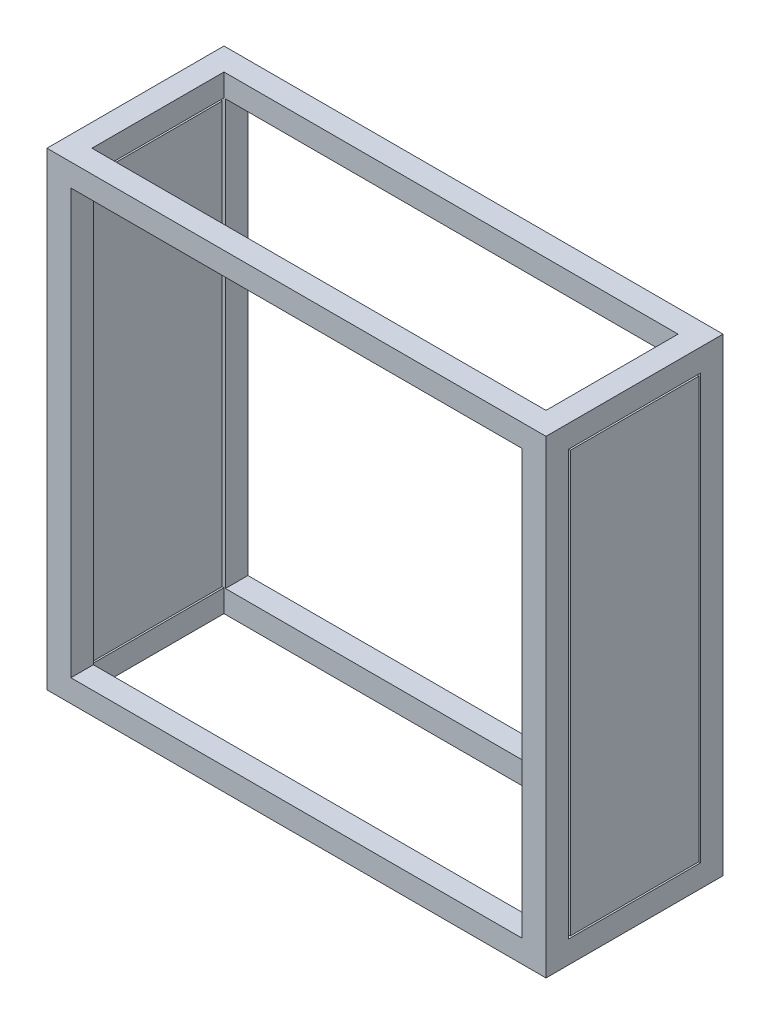
ISO-10303-21;
HEADER;
FILE_DESCRIPTION(('STEP AP214'),'2;1');
FILE_NAME('part.step','',(''),(''),'','','');
FILE_SCHEMA(('AUTOMOTIVE_DESIGN { 1 0 10303 214 1 1 1 1 }'));
ENDSEC;
DATA;
#1=APPLICATION_CONTEXT('core data for automotive mechanical design processes');
#2=APPLICATION_PROTOCOL_DEFINITION('international standard','automotive_design',2000,#1);
#3=PRODUCT_CONTEXT('',#1,'mechanical');
#4=PRODUCT('Part','Part','',(#3));
#5=PRODUCT_RELATED_PRODUCT_CATEGORY('part','',(#4));
#6=PRODUCT_DEFINITION_FORMATION('','',#4);
#7=PRODUCT_DEFINITION_CONTEXT('part definition',#1,'design');
#8=PRODUCT_DEFINITION('design','',#6,#7);
#9=PRODUCT_DEFINITION_SHAPE('','',#8);
#10=(LENGTH_UNIT() NAMED_UNIT(*) SI_UNIT(.MILLI.,.METRE.));
#11=(NAMED_UNIT(*) PLANE_ANGLE_UNIT() SI_UNIT($,.RADIAN.));
#12=(NAMED_UNIT(*) SI_UNIT($,.STERADIAN.) SOLID_ANGLE_UNIT());
#13=UNCERTAINTY_MEASURE_WITH_UNIT(LENGTH_MEASURE(1.E-05),#10,'distance_accuracy_value','');
#14=(GEOMETRIC_REPRESENTATION_CONTEXT(3) GLOBAL_UNCERTAINTY_ASSIGNED_CONTEXT((#13)) GLOBAL_UNIT_ASSIGNED_CONTEXT((#10,
#11,#12)) REPRESENTATION_CONTEXT('',''));
#15=CARTESIAN_POINT('',(0.,0.,0.));
#16=DIRECTION('',(0.,0.,1.));
#17=DIRECTION('',(1.,0.,0.));
#18=AXIS2_PLACEMENT_3D('',#15,#16,#17);
#19=CARTESIAN_POINT('',(-256.5,-237.6,-172.6));
#20=DIRECTION('',(0.,0.,-1.));
#21=DIRECTION('',(0.,1.,0.));
#22=AXIS2_PLACEMENT_3D('',#19,#20,#21);
#23=PLANE('',#22);
#24=DIRECTION('',(-1.,0.,0.));
#25=VECTOR('',#24,1.);
#26=CARTESIAN_POINT('',(-256.5,-237.6,-172.6));
#27=LINE('',#26,#25);
#28=CARTESIAN_POINT('',(-256.5,-237.6,-172.6));
#29=VERTEX_POINT('',#28);
#30=CARTESIAN_POINT('',(-271.9,-237.6,-172.6));
#31=VERTEX_POINT('',#30);
#32=EDGE_CURVE('E46',#29,#31,#27,.T.);
#33=ORIENTED_EDGE('',*,*,#32,.T.);
#34=DIRECTION('',(0.,-1.,0.));
#35=VECTOR('',#34,1.);
#36=CARTESIAN_POINT('',(-271.9,-237.6,-172.6));
#37=LINE('',#36,#35);
#38=CARTESIAN_POINT('',(-271.9,237.6,-172.6));
#39=VERTEX_POINT('',#38);
#40=EDGE_CURVE('E59',#39,#31,#37,.T.);
#41=ORIENTED_EDGE('',*,*,#40,.F.);
#42=DIRECTION('',(-1.,0.,0.));
#43=VECTOR('',#42,1.);
#44=CARTESIAN_POINT('',(-256.5,237.6,-172.6));
#45=LINE('',#44,#43);
#46=CARTESIAN_POINT('',(-256.5,237.6,-172.6));
#47=VERTEX_POINT('',#46);
#48=EDGE_CURVE('E12',#47,#39,#45,.T.);
#49=ORIENTED_EDGE('',*,*,#48,.F.);
#50=DIRECTION('',(0.,-1.,0.));
#51=VECTOR('',#50,1.);
#52=CARTESIAN_POINT('',(-256.5,-237.6,-172.6));
#53=LINE('',#52,#51);
#54=EDGE_CURVE('E110',#47,#29,#53,.T.);
#55=ORIENTED_EDGE('',*,*,#54,.T.);
#56=EDGE_LOOP('',(#33,#41,#49,#55));
#57=FACE_BOUND('',#56,.T.);
#58=ADVANCED_FACE('F43',(#57),#23,.T.);
#59=CARTESIAN_POINT('',(-256.5,237.6,-172.6));
#60=DIRECTION('',(0.,1.,0.));
#61=DIRECTION('',(0.,0.,1.));
#62=AXIS2_PLACEMENT_3D('',#59,#60,#61);
#63=PLANE('',#62);
#64=ORIENTED_EDGE('',*,*,#48,.T.);
#65=DIRECTION('',(0.,0.,-1.));
#66=VECTOR('',#65,1.);
#67=CARTESIAN_POINT('',(-271.9,237.6,-27.4));
#68=LINE('',#67,#66);
#69=CARTESIAN_POINT('',(-271.9,237.6,-27.4));
#70=VERTEX_POINT('',#69);
#71=EDGE_CURVE('E96',#70,#39,#68,.T.);
#72=ORIENTED_EDGE('',*,*,#71,.F.);
#73=DIRECTION('',(-1.,0.,0.));
#74=VECTOR('',#73,1.);
#75=CARTESIAN_POINT('',(-256.5,237.6,-27.4));
#76=LINE('',#75,#74);
#77=CARTESIAN_POINT('',(-256.5,237.6,-27.4));
#78=VERTEX_POINT('',#77);
#79=EDGE_CURVE('E51',#78,#70,#76,.T.);
#80=ORIENTED_EDGE('',*,*,#79,.F.);
#81=DIRECTION('',(0.,0.,-1.));
#82=VECTOR('',#81,1.);
#83=CARTESIAN_POINT('',(-256.5,237.6,-172.6));
#84=LINE('',#83,#82);
#85=EDGE_CURVE('E103',#78,#47,#84,.T.);
#86=ORIENTED_EDGE('',*,*,#85,.T.);
#87=EDGE_LOOP('',(#64,#72,#80,#86));
#88=FACE_BOUND('',#87,.T.);
#89=ADVANCED_FACE('F114',(#88),#63,.T.);
#90=CARTESIAN_POINT('',(-256.5,237.6,-27.4));
#91=DIRECTION('',(0.,0.,1.));
#92=DIRECTION('',(0.,-1.,0.));
#93=AXIS2_PLACEMENT_3D('',#90,#91,#92);
#94=PLANE('',#93);
#95=ORIENTED_EDGE('',*,*,#79,.T.);
#96=DIRECTION('',(0.,1.,0.));
#97=VECTOR('',#96,1.);
#98=CARTESIAN_POINT('',(-271.9,-237.6,-27.4));
#99=LINE('',#98,#97);
#100=CARTESIAN_POINT('',(-271.9,-237.6,-27.4));
#101=VERTEX_POINT('',#100);
#102=EDGE_CURVE('E84',#101,#70,#99,.T.);
#103=ORIENTED_EDGE('',*,*,#102,.F.);
#104=DIRECTION('',(-1.,0.,0.));
#105=VECTOR('',#104,1.);
#106=CARTESIAN_POINT('',(-256.5,-237.6,-27.4000000000001));
#107=LINE('',#106,#105);
#108=CARTESIAN_POINT('',(-256.5,-237.6,-27.4000000000001));
#109=VERTEX_POINT('',#108);
#110=EDGE_CURVE('E94',#109,#101,#107,.T.);
#111=ORIENTED_EDGE('',*,*,#110,.F.);
#112=DIRECTION('',(0.,1.,0.));
#113=VECTOR('',#112,1.);
#114=CARTESIAN_POINT('',(-256.5,237.6,-27.4));
#115=LINE('',#114,#113);
#116=EDGE_CURVE('E107',#109,#78,#115,.T.);
#117=ORIENTED_EDGE('',*,*,#116,.T.);
#118=EDGE_LOOP('',(#95,#103,#111,#117));
#119=FACE_BOUND('',#118,.T.);
#120=ADVANCED_FACE('F92',(#119),#94,.T.);
#121=CARTESIAN_POINT('',(-256.5,-237.6,-27.4000000000001));
#122=DIRECTION('',(0.,-1.,0.));
#123=DIRECTION('',(0.,0.,-1.));
#124=AXIS2_PLACEMENT_3D('',#121,#122,#123);
#125=PLANE('',#124);
#126=ORIENTED_EDGE('',*,*,#110,.T.);
#127=DIRECTION('',(0.,0.,1.));
#128=VECTOR('',#127,1.);
#129=CARTESIAN_POINT('',(-271.9,-237.6,-27.4));
#130=LINE('',#129,#128);
#131=EDGE_CURVE('E81',#31,#101,#130,.T.);
#132=ORIENTED_EDGE('',*,*,#131,.F.);
#133=ORIENTED_EDGE('',*,*,#32,.F.);
#134=DIRECTION('',(0.,0.,1.));
#135=VECTOR('',#134,1.);
#136=CARTESIAN_POINT('',(-256.5,-237.6,-27.4000000000001));
#137=LINE('',#136,#135);
#138=EDGE_CURVE('E101',#29,#109,#137,.T.);
#139=ORIENTED_EDGE('',*,*,#138,.T.);
#140=EDGE_LOOP('',(#126,#132,#133,#139));
#141=FACE_BOUND('',#140,.T.);
#142=ADVANCED_FACE('F99',(#141),#125,.T.);
#143=CARTESIAN_POINT('',(-256.5,0.,0.));
#144=DIRECTION('',(1.,0.,0.));
#145=DIRECTION('',(0.,0.,-1.));
#146=AXIS2_PLACEMENT_3D('',#143,#144,#145);
#147=PLANE('',#146);
#148=ORIENTED_EDGE('',*,*,#54,.F.);
#149=ORIENTED_EDGE('',*,*,#85,.F.);
#150=ORIENTED_EDGE('',*,*,#116,.F.);
#151=ORIENTED_EDGE('',*,*,#138,.F.);
#152=EDGE_LOOP('',(#148,#149,#150,#151));
#153=FACE_BOUND('',#152,.T.);
#154=ADVANCED_FACE('F117',(#153),#147,.T.);
#155=CARTESIAN_POINT('',(-271.9,0.,0.));
#156=DIRECTION('',(-1.,0.,0.));
#157=DIRECTION('',(0.,0.,1.));
#158=AXIS2_PLACEMENT_3D('',#155,#156,#157);
#159=PLANE('',#158);
#160=ORIENTED_EDGE('',*,*,#40,.T.);
#161=ORIENTED_EDGE('',*,*,#131,.T.);
#162=ORIENTED_EDGE('',*,*,#102,.T.);
#163=ORIENTED_EDGE('',*,*,#71,.T.);
#164=EDGE_LOOP('',(#160,#161,#162,#163));
#165=FACE_BOUND('',#164,.T.);
#166=ADVANCED_FACE('F83',(#165),#159,.T.);
#167=CLOSED_SHELL('',(#58,#89,#120,#142,#154,#166));
#168=MANIFOLD_SOLID_BREP('B2',#167);
#169=CARTESIAN_POINT('',(256.5,237.6,-172.6));
#170=DIRECTION('',(0.,0.,-1.));
#171=DIRECTION('',(0.,1.,0.));
#172=AXIS2_PLACEMENT_3D('',#169,#170,#171);
#173=PLANE('',#172);
#174=DIRECTION('',(0.,1.,0.));
#175=VECTOR('',#174,1.);
#176=CARTESIAN_POINT('',(281.9,237.6,-172.6));
#177=LINE('',#176,#175);
#178=CARTESIAN_POINT('',(281.9,-237.6,-172.6));
#179=VERTEX_POINT('',#178);
#180=CARTESIAN_POINT('',(281.9,237.6,-172.6));
#181=VERTEX_POINT('',#180);
#182=EDGE_CURVE('E239',#179,#181,#177,.T.);
#183=ORIENTED_EDGE('',*,*,#182,.F.);
#184=DIRECTION('',(1.,0.,0.));
#185=VECTOR('',#184,1.);
#186=CARTESIAN_POINT('',(256.5,-237.6,-172.6));
#187=LINE('',#186,#185);
#188=CARTESIAN_POINT('',(256.5,-237.6,-172.6));
#189=VERTEX_POINT('',#188);
#190=EDGE_CURVE('E41',#189,#179,#187,.T.);
#191=ORIENTED_EDGE('',*,*,#190,.F.);
#192=DIRECTION('',(0.,1.,0.));
#193=VECTOR('',#192,1.);
#194=CARTESIAN_POINT('',(256.5,237.6,-172.6));
#195=LINE('',#194,#193);
#196=CARTESIAN_POINT('',(256.5,237.6,-172.6));
#197=VERTEX_POINT('',#196);
#198=EDGE_CURVE('E233',#189,#197,#195,.T.);
#199=ORIENTED_EDGE('',*,*,#198,.T.);
#200=DIRECTION('',(1.,0.,0.));
#201=VECTOR('',#200,1.);
#202=CARTESIAN_POINT('',(256.5,237.6,-172.6));
#203=LINE('',#202,#201);
#204=EDGE_CURVE('E178',#197,#181,#203,.T.);
#205=ORIENTED_EDGE('',*,*,#204,.T.);
#206=EDGE_LOOP('',(#183,#191,#199,#205));
#207=FACE_BOUND('',#206,.T.);
#208=ADVANCED_FACE('F175',(#207),#173,.T.);
#209=CARTESIAN_POINT('',(256.5,-237.6,-27.4000000000001));
#210=DIRECTION('',(0.,-1.,0.));
#211=DIRECTION('',(1.,0.,0.));
#212=AXIS2_PLACEMENT_3D('',#209,#210,#211);
#213=PLANE('',#212);
#214=DIRECTION('',(0.,0.,-1.));
#215=VECTOR('',#214,1.);
#216=CARTESIAN_POINT('',(281.9,-237.6,-27.4000000000001));
#217=LINE('',#216,#215);
#218=CARTESIAN_POINT('',(281.9,-237.6,-27.4000000000001));
#219=VERTEX_POINT('',#218);
#220=EDGE_CURVE('E235',#219,#179,#217,.T.);
#221=ORIENTED_EDGE('',*,*,#220,.F.);
#222=DIRECTION('',(1.,0.,0.));
#223=VECTOR('',#222,1.);
#224=CARTESIAN_POINT('',(256.5,-237.6,-27.4000000000001));
#225=LINE('',#224,#223);
#226=CARTESIAN_POINT('',(256.5,-237.6,-27.4000000000001));
#227=VERTEX_POINT('',#226);
#228=EDGE_CURVE('E184',#227,#219,#225,.T.);
#229=ORIENTED_EDGE('',*,*,#228,.F.);
#230=DIRECTION('',(0.,0.,-1.));
#231=VECTOR('',#230,1.);
#232=CARTESIAN_POINT('',(256.5,-237.6,-27.4000000000001));
#233=LINE('',#232,#231);
#234=EDGE_CURVE('E230',#227,#189,#233,.T.);
#235=ORIENTED_EDGE('',*,*,#234,.T.);
#236=ORIENTED_EDGE('',*,*,#190,.T.);
#237=EDGE_LOOP('',(#221,#229,#235,#236));
#238=FACE_BOUND('',#237,.T.);
#239=ADVANCED_FACE('F249',(#238),#213,.T.);
#240=CARTESIAN_POINT('',(256.5,237.6,-27.4));
#241=DIRECTION('',(0.,0.,1.));
#242=DIRECTION('',(0.,-1.,0.));
#243=AXIS2_PLACEMENT_3D('',#240,#241,#242);
#244=PLANE('',#243);
#245=DIRECTION('',(0.,-1.,0.));
#246=VECTOR('',#245,1.);
#247=CARTESIAN_POINT('',(281.9,237.6,-27.4));
#248=LINE('',#247,#246);
#249=CARTESIAN_POINT('',(281.9,237.6,-27.4));
#250=VERTEX_POINT('',#249);
#251=EDGE_CURVE('E225',#250,#219,#248,.T.);
#252=ORIENTED_EDGE('',*,*,#251,.F.);
#253=DIRECTION('',(1.,0.,0.));
#254=VECTOR('',#253,1.);
#255=CARTESIAN_POINT('',(256.5,237.6,-27.4));
#256=LINE('',#255,#254);
#257=CARTESIAN_POINT('',(256.5,237.6,-27.4));
#258=VERTEX_POINT('',#257);
#259=EDGE_CURVE('E220',#258,#250,#256,.T.);
#260=ORIENTED_EDGE('',*,*,#259,.F.);
#261=DIRECTION('',(0.,-1.,0.));
#262=VECTOR('',#261,1.);
#263=CARTESIAN_POINT('',(256.5,237.6,-27.4));
#264=LINE('',#263,#262);
#265=EDGE_CURVE('E223',#258,#227,#264,.T.);
#266=ORIENTED_EDGE('',*,*,#265,.T.);
#267=ORIENTED_EDGE('',*,*,#228,.T.);
#268=EDGE_LOOP('',(#252,#260,#266,#267));
#269=FACE_BOUND('',#268,.T.);
#270=ADVANCED_FACE('F222',(#269),#244,.T.);
#271=CARTESIAN_POINT('',(256.5,237.6,-27.4));
#272=DIRECTION('',(0.,1.,0.));
#273=DIRECTION('',(-1.,0.,0.));
#274=AXIS2_PLACEMENT_3D('',#271,#272,#273);
#275=PLANE('',#274);
#276=DIRECTION('',(0.,0.,1.));
#277=VECTOR('',#276,1.);
#278=CARTESIAN_POINT('',(281.9,237.6,-27.4));
#279=LINE('',#278,#277);
#280=EDGE_CURVE('E242',#181,#250,#279,.T.);
#281=ORIENTED_EDGE('',*,*,#280,.F.);
#282=ORIENTED_EDGE('',*,*,#204,.F.);
#283=DIRECTION('',(0.,0.,1.));
#284=VECTOR('',#283,1.);
#285=CARTESIAN_POINT('',(256.5,237.6,-27.4));
#286=LINE('',#285,#284);
#287=EDGE_CURVE('E229',#197,#258,#286,.T.);
#288=ORIENTED_EDGE('',*,*,#287,.T.);
#289=ORIENTED_EDGE('',*,*,#259,.T.);
#290=EDGE_LOOP('',(#281,#282,#288,#289));
#291=FACE_BOUND('',#290,.T.);
#292=ADVANCED_FACE('F232',(#291),#275,.T.);
#293=CARTESIAN_POINT('',(256.5,0.,0.));
#294=DIRECTION('',(1.,0.,0.));
#295=DIRECTION('',(0.,1.,0.));
#296=AXIS2_PLACEMENT_3D('',#293,#294,#295);
#297=PLANE('',#296);
#298=ORIENTED_EDGE('',*,*,#198,.F.);
#299=ORIENTED_EDGE('',*,*,#234,.F.);
#300=ORIENTED_EDGE('',*,*,#265,.F.);
#301=ORIENTED_EDGE('',*,*,#287,.F.);
#302=EDGE_LOOP('',(#298,#299,#300,#301));
#303=FACE_BOUND('',#302,.T.);
#304=ADVANCED_FACE('F228',(#303),#297,.F.);
#305=CARTESIAN_POINT('',(281.9,0.,0.));
#306=DIRECTION('',(1.,0.,0.));
#307=DIRECTION('',(0.,1.,0.));
#308=AXIS2_PLACEMENT_3D('',#305,#306,#307);
#309=PLANE('',#308);
#310=ORIENTED_EDGE('',*,*,#182,.T.);
#311=ORIENTED_EDGE('',*,*,#280,.T.);
#312=ORIENTED_EDGE('',*,*,#251,.T.);
#313=ORIENTED_EDGE('',*,*,#220,.T.);
#314=EDGE_LOOP('',(#310,#311,#312,#313));
#315=FACE_BOUND('',#314,.T.);
#316=ADVANCED_FACE('F248',(#315),#309,.T.);
#317=CLOSED_SHELL('',(#208,#239,#270,#292,#304,#316));
#318=MANIFOLD_SOLID_BREP('B6',#317);
#319=CARTESIAN_POINT('',(-254.880150943396,-239.6,-200.));
#320=DIRECTION('',(0.,-1.,0.));
#321=DIRECTION('',(0.,0.,-1.));
#322=AXIS2_PLACEMENT_3D('',#319,#320,#321);
#323=PLANE('',#322);
#324=DIRECTION('',(1.,0.,0.));
#325=VECTOR('',#324,1.);
#326=CARTESIAN_POINT('',(-783.789708999896,-239.6,-25.4));
#327=LINE('',#326,#325);
#328=CARTESIAN_POINT('',(-281.9,-239.6,-25.4));
#329=VERTEX_POINT('',#328);
#330=CARTESIAN_POINT('',(-256.5,-239.6,-25.4));
#331=VERTEX_POINT('',#330);
#332=EDGE_CURVE('E542',#329,#331,#327,.T.);
#333=ORIENTED_EDGE('',*,*,#332,.T.);
#334=DIRECTION('',(0.,0.,-1.));
#335=VECTOR('',#334,1.);
#336=CARTESIAN_POINT('',(-256.5,-239.6,-200.));
#337=LINE('',#336,#335);
#338=CARTESIAN_POINT('',(-256.5,-239.6,-174.6));
#339=VERTEX_POINT('',#338);
#340=EDGE_CURVE('E486',#331,#339,#337,.T.);
#341=ORIENTED_EDGE('',*,*,#340,.T.);
#342=DIRECTION('',(1.,0.,0.));
#343=VECTOR('',#342,1.);
#344=CARTESIAN_POINT('',(-783.789708999896,-239.6,-174.6));
#345=LINE('',#344,#343);
#346=CARTESIAN_POINT('',(-281.9,-239.6,-174.6));
#347=VERTEX_POINT('',#346);
#348=EDGE_CURVE('E537',#347,#339,#345,.T.);
#349=ORIENTED_EDGE('',*,*,#348,.F.);
#350=DIRECTION('',(0.,0.,-1.));
#351=VECTOR('',#350,1.);
#352=CARTESIAN_POINT('',(-281.9,-239.6,-25.4));
#353=LINE('',#352,#351);
#354=EDGE_CURVE('E538',#329,#347,#353,.T.);
#355=ORIENTED_EDGE('',*,*,#354,.F.);
#356=EDGE_LOOP('',(#333,#341,#349,#355));
#357=FACE_BOUND('',#356,.T.);
#358=ADVANCED_FACE('F298',(#357),#323,.F.);
#359=DIRECTION('',(0.,0.,1.));
#360=VECTOR('',#359,1.);
#361=CARTESIAN_POINT('',(254.880150943396,-239.6,-200.));
#362=LINE('',#361,#360);
#363=CARTESIAN_POINT('',(254.880150943396,-239.6,-25.4));
#364=VERTEX_POINT('',#363);
#365=CARTESIAN_POINT('',(254.880150943396,-239.6,0.));
#366=VERTEX_POINT('',#365);
#367=EDGE_CURVE('E593',#364,#366,#362,.T.);
#368=ORIENTED_EDGE('',*,*,#367,.F.);
#369=DIRECTION('',(-1.,0.,0.));
#370=VECTOR('',#369,1.);
#371=CARTESIAN_POINT('',(-254.880150943396,-239.6,-25.4));
#372=LINE('',#371,#370);
#373=CARTESIAN_POINT('',(-254.880150943396,-239.6,-25.4));
#374=VERTEX_POINT('',#373);
#375=EDGE_CURVE('E173',#364,#374,#372,.T.);
#376=ORIENTED_EDGE('',*,*,#375,.T.);
#377=DIRECTION('',(0.,0.,1.));
#378=VECTOR('',#377,1.);
#379=CARTESIAN_POINT('',(-254.880150943396,-239.6,-200.));
#380=LINE('',#379,#378);
#381=CARTESIAN_POINT('',(-254.880150943396,-239.6,0.));
#382=VERTEX_POINT('',#381);
#383=EDGE_CURVE('E597',#374,#382,#380,.T.);
#384=ORIENTED_EDGE('',*,*,#383,.T.);
#385=DIRECTION('',(1.,0.,0.));
#386=VECTOR('',#385,1.);
#387=CARTESIAN_POINT('',(-254.880150943396,-239.6,0.));
#388=LINE('',#387,#386);
#389=EDGE_CURVE('E569',#382,#366,#388,.T.);
#390=ORIENTED_EDGE('',*,*,#389,.T.);
#391=EDGE_LOOP('',(#368,#376,#384,#390));
#392=FACE_BOUND('',#391,.T.);
#393=ADVANCED_FACE('F672',(#392),#323,.F.);
#394=CARTESIAN_POINT('',(256.5,-239.6,-174.6));
#395=VERTEX_POINT('',#394);
#396=CARTESIAN_POINT('',(281.9,-239.6,-174.6));
#397=VERTEX_POINT('',#396);
#398=EDGE_CURVE('E541',#395,#397,#345,.T.);
#399=ORIENTED_EDGE('',*,*,#398,.F.);
#400=DIRECTION('',(0.,0.,1.));
#401=VECTOR('',#400,1.);
#402=CARTESIAN_POINT('',(256.5,-239.6,-200.));
#403=LINE('',#402,#401);
#404=CARTESIAN_POINT('',(256.5,-239.6,-25.4));
#405=VERTEX_POINT('',#404);
#406=EDGE_CURVE('E462',#395,#405,#403,.T.);
#407=ORIENTED_EDGE('',*,*,#406,.T.);
#408=CARTESIAN_POINT('',(281.9,-239.6,-25.4));
#409=VERTEX_POINT('',#408);
#410=EDGE_CURVE('E546',#405,#409,#327,.T.);
#411=ORIENTED_EDGE('',*,*,#410,.T.);
#412=DIRECTION('',(0.,0.,-1.));
#413=VECTOR('',#412,1.);
#414=CARTESIAN_POINT('',(281.9,-239.6,-25.4));
#415=LINE('',#414,#413);
#416=EDGE_CURVE('E518',#409,#397,#415,.T.);
#417=ORIENTED_EDGE('',*,*,#416,.T.);
#418=EDGE_LOOP('',(#399,#407,#411,#417));
#419=FACE_BOUND('',#418,.T.);
#420=ADVANCED_FACE('F659',(#419),#323,.F.);
#421=CARTESIAN_POINT('',(-254.880150943396,239.6,-200.));
#422=DIRECTION('',(0.,1.,0.));
#423=DIRECTION('',(0.,0.,1.));
#424=AXIS2_PLACEMENT_3D('',#421,#422,#423);
#425=PLANE('',#424);
#426=DIRECTION('',(1.,0.,0.));
#427=VECTOR('',#426,1.);
#428=CARTESIAN_POINT('',(-783.789708999896,239.6,-174.6));
#429=LINE('',#428,#427);
#430=CARTESIAN_POINT('',(-281.9,239.6,-174.6));
#431=VERTEX_POINT('',#430);
#432=CARTESIAN_POINT('',(-256.5,239.6,-174.6));
#433=VERTEX_POINT('',#432);
#434=EDGE_CURVE('E553',#431,#433,#429,.T.);
#435=ORIENTED_EDGE('',*,*,#434,.T.);
#436=DIRECTION('',(0.,0.,1.));
#437=VECTOR('',#436,1.);
#438=CARTESIAN_POINT('',(-256.5,239.6,-200.));
#439=LINE('',#438,#437);
#440=CARTESIAN_POINT('',(-256.5,239.6,-25.4));
#441=VERTEX_POINT('',#440);
#442=EDGE_CURVE('E514',#433,#441,#439,.T.);
#443=ORIENTED_EDGE('',*,*,#442,.T.);
#444=DIRECTION('',(1.,0.,0.));
#445=VECTOR('',#444,1.);
#446=CARTESIAN_POINT('',(-783.789708999896,239.6,-25.4));
#447=LINE('',#446,#445);
#448=CARTESIAN_POINT('',(-281.9,239.6,-25.4));
#449=VERTEX_POINT('',#448);
#450=EDGE_CURVE('E547',#449,#441,#447,.T.);
#451=ORIENTED_EDGE('',*,*,#450,.F.);
#452=DIRECTION('',(0.,0.,1.));
#453=VECTOR('',#452,1.);
#454=CARTESIAN_POINT('',(-281.9,239.6,-25.4));
#455=LINE('',#454,#453);
#456=EDGE_CURVE('E521',#431,#449,#455,.T.);
#457=ORIENTED_EDGE('',*,*,#456,.F.);
#458=EDGE_LOOP('',(#435,#443,#451,#457));
#459=FACE_BOUND('',#458,.T.);
#460=ADVANCED_FACE('F675',(#459),#425,.F.);
#461=DIRECTION('',(0.,0.,1.));
#462=VECTOR('',#461,1.);
#463=CARTESIAN_POINT('',(254.880150943396,239.6,-200.));
#464=LINE('',#463,#462);
#465=CARTESIAN_POINT('',(254.880150943396,239.6,-200.));
#466=VERTEX_POINT('',#465);
#467=CARTESIAN_POINT('',(254.880150943396,239.6,-174.6));
#468=VERTEX_POINT('',#467);
#469=EDGE_CURVE('E602',#466,#468,#464,.T.);
#470=ORIENTED_EDGE('',*,*,#469,.T.);
#471=DIRECTION('',(-1.,0.,0.));
#472=VECTOR('',#471,1.);
#473=CARTESIAN_POINT('',(-254.880150943396,239.6,-174.6));
#474=LINE('',#473,#472);
#475=CARTESIAN_POINT('',(-254.880150943396,239.6,-174.6));
#476=VERTEX_POINT('',#475);
#477=EDGE_CURVE('E306',#468,#476,#474,.T.);
#478=ORIENTED_EDGE('',*,*,#477,.T.);
#479=DIRECTION('',(0.,0.,1.));
#480=VECTOR('',#479,1.);
#481=CARTESIAN_POINT('',(-254.880150943396,239.6,-200.));
#482=LINE('',#481,#480);
#483=CARTESIAN_POINT('',(-254.880150943396,239.6,-200.));
#484=VERTEX_POINT('',#483);
#485=EDGE_CURVE('E598',#484,#476,#482,.T.);
#486=ORIENTED_EDGE('',*,*,#485,.F.);
#487=DIRECTION('',(-1.,0.,0.));
#488=VECTOR('',#487,1.);
#489=CARTESIAN_POINT('',(-254.880150943396,239.6,-200.));
#490=LINE('',#489,#488);
#491=EDGE_CURVE('E568',#466,#484,#490,.T.);
#492=ORIENTED_EDGE('',*,*,#491,.F.);
#493=EDGE_LOOP('',(#470,#478,#486,#492));
#494=FACE_BOUND('',#493,.T.);
#495=ADVANCED_FACE('F641',(#494),#425,.F.);
#496=CARTESIAN_POINT('',(256.5,239.6,-25.4));
#497=VERTEX_POINT('',#496);
#498=CARTESIAN_POINT('',(281.9,239.6,-25.4));
#499=VERTEX_POINT('',#498);
#500=EDGE_CURVE('E532',#497,#499,#447,.T.);
#501=ORIENTED_EDGE('',*,*,#500,.F.);
#502=DIRECTION('',(0.,0.,-1.));
#503=VECTOR('',#502,1.);
#504=CARTESIAN_POINT('',(256.5,239.6,-200.));
#505=LINE('',#504,#503);
#506=CARTESIAN_POINT('',(256.5,239.6,-174.6));
#507=VERTEX_POINT('',#506);
#508=EDGE_CURVE('E505',#497,#507,#505,.T.);
#509=ORIENTED_EDGE('',*,*,#508,.T.);
#510=CARTESIAN_POINT('',(281.9,239.6,-174.6));
#511=VERTEX_POINT('',#510);
#512=EDGE_CURVE('E536',#507,#511,#429,.T.);
#513=ORIENTED_EDGE('',*,*,#512,.T.);
#514=DIRECTION('',(0.,0.,1.));
#515=VECTOR('',#514,1.);
#516=CARTESIAN_POINT('',(281.9,239.6,-25.4));
#517=LINE('',#516,#515);
#518=EDGE_CURVE('E525',#511,#499,#517,.T.);
#519=ORIENTED_EDGE('',*,*,#518,.T.);
#520=EDGE_LOOP('',(#501,#509,#513,#519));
#521=FACE_BOUND('',#520,.T.);
#522=ADVANCED_FACE('F694',(#521),#425,.F.);
#523=CARTESIAN_POINT('',(254.880150943396,239.6,-200.));
#524=DIRECTION('',(1.,0.,0.));
#525=DIRECTION('',(0.,0.,-1.));
#526=AXIS2_PLACEMENT_3D('',#523,#524,#525);
#527=PLANE('',#526);
#528=CARTESIAN_POINT('',(254.880150943396,239.6,-25.4));
#529=VERTEX_POINT('',#528);
#530=CARTESIAN_POINT('',(254.880150943396,239.6,0.));
#531=VERTEX_POINT('',#530);
#532=EDGE_CURVE('E578',#529,#531,#464,.T.);
#533=ORIENTED_EDGE('',*,*,#532,.F.);
#534=DIRECTION('',(0.,-1.,0.));
#535=VECTOR('',#534,1.);
#536=CARTESIAN_POINT('',(254.880150943396,239.6,-25.4));
#537=LINE('',#536,#535);
#538=EDGE_CURVE('E562',#529,#364,#537,.T.);
#539=ORIENTED_EDGE('',*,*,#538,.T.);
#540=ORIENTED_EDGE('',*,*,#367,.T.);
#541=DIRECTION('',(0.,1.,0.));
#542=VECTOR('',#541,1.);
#543=CARTESIAN_POINT('',(254.880150943396,239.6,0.));
#544=LINE('',#543,#542);
#545=EDGE_CURVE('E564',#366,#531,#544,.T.);
#546=ORIENTED_EDGE('',*,*,#545,.T.);
#547=EDGE_LOOP('',(#533,#539,#540,#546));
#548=FACE_BOUND('',#547,.T.);
#549=ADVANCED_FACE('F669',(#548),#527,.F.);
#550=CARTESIAN_POINT('',(-254.880150943396,239.6,-200.));
#551=DIRECTION('',(-1.,0.,0.));
#552=DIRECTION('',(0.,0.,1.));
#553=AXIS2_PLACEMENT_3D('',#550,#551,#552);
#554=PLANE('',#553);
#555=ORIENTED_EDGE('',*,*,#383,.F.);
#556=DIRECTION('',(0.,1.,0.));
#557=VECTOR('',#556,1.);
#558=CARTESIAN_POINT('',(-254.880150943396,239.6,-25.4));
#559=LINE('',#558,#557);
#560=CARTESIAN_POINT('',(-254.880150943396,239.6,-25.4));
#561=VERTEX_POINT('',#560);
#562=EDGE_CURVE('E560',#374,#561,#559,.T.);
#563=ORIENTED_EDGE('',*,*,#562,.T.);
#564=CARTESIAN_POINT('',(-254.880150943396,239.6,0.));
#565=VERTEX_POINT('',#564);
#566=EDGE_CURVE('E601',#561,#565,#482,.T.);
#567=ORIENTED_EDGE('',*,*,#566,.T.);
#568=DIRECTION('',(0.,-1.,0.));
#569=VECTOR('',#568,1.);
#570=CARTESIAN_POINT('',(-254.880150943396,239.6,0.));
#571=LINE('',#570,#569);
#572=EDGE_CURVE('E584',#565,#382,#571,.T.);
#573=ORIENTED_EDGE('',*,*,#572,.T.);
#574=EDGE_LOOP('',(#555,#563,#567,#573));
#575=FACE_BOUND('',#574,.T.);
#576=ADVANCED_FACE('F666',(#575),#554,.F.);
#577=CARTESIAN_POINT('',(281.9,265.,-200.));
#578=DIRECTION('',(1.,0.,0.));
#579=DIRECTION('',(0.,1.,0.));
#580=AXIS2_PLACEMENT_3D('',#577,#578,#579);
#581=PLANE('',#580);
#582=ORIENTED_EDGE('',*,*,#518,.F.);
#583=DIRECTION('',(0.,1.,0.));
#584=VECTOR('',#583,1.);
#585=CARTESIAN_POINT('',(281.9,239.6,-174.6));
#586=LINE('',#585,#584);
#587=EDGE_CURVE('E517',#397,#511,#586,.T.);
#588=ORIENTED_EDGE('',*,*,#587,.F.);
#589=ORIENTED_EDGE('',*,*,#416,.F.);
#590=DIRECTION('',(0.,-1.,0.));
#591=VECTOR('',#590,1.);
#592=CARTESIAN_POINT('',(281.9,239.6,-25.4));
#593=LINE('',#592,#591);
#594=EDGE_CURVE('E522',#499,#409,#593,.T.);
#595=ORIENTED_EDGE('',*,*,#594,.F.);
#596=EDGE_LOOP('',(#582,#588,#589,#595));
#597=FACE_BOUND('',#596,.T.);
#598=DIRECTION('',(0.,1.,0.));
#599=VECTOR('',#598,1.);
#600=CARTESIAN_POINT('',(281.9,265.,0.));
#601=LINE('',#600,#599);
#602=CARTESIAN_POINT('',(281.9,-265.,0.));
#603=VERTEX_POINT('',#602);
#604=CARTESIAN_POINT('',(281.9,265.,0.));
#605=VERTEX_POINT('',#604);
#606=EDGE_CURVE('E592',#603,#605,#601,.T.);
#607=ORIENTED_EDGE('',*,*,#606,.F.);
#608=DIRECTION('',(0.,0.,1.));
#609=VECTOR('',#608,1.);
#610=CARTESIAN_POINT('',(281.9,-265.,-200.));
#611=LINE('',#610,#609);
#612=CARTESIAN_POINT('',(281.9,-265.,-200.));
#613=VERTEX_POINT('',#612);
#614=EDGE_CURVE('E629',#613,#603,#611,.T.);
#615=ORIENTED_EDGE('',*,*,#614,.F.);
#616=DIRECTION('',(0.,1.,0.));
#617=VECTOR('',#616,1.);
#618=CARTESIAN_POINT('',(281.9,265.,-200.));
#619=LINE('',#618,#617);
#620=CARTESIAN_POINT('',(281.9,265.,-200.));
#621=VERTEX_POINT('',#620);
#622=EDGE_CURVE('E605',#613,#621,#619,.T.);
#623=ORIENTED_EDGE('',*,*,#622,.T.);
#624=DIRECTION('',(0.,0.,1.));
#625=VECTOR('',#624,1.);
#626=CARTESIAN_POINT('',(281.9,265.,-200.));
#627=LINE('',#626,#625);
#628=EDGE_CURVE('E618',#621,#605,#627,.T.);
#629=ORIENTED_EDGE('',*,*,#628,.T.);
#630=EDGE_LOOP('',(#607,#615,#623,#629));
#631=FACE_BOUND('',#630,.T.);
#632=ADVANCED_FACE('F300',(#597,#631),#581,.T.);
#633=CARTESIAN_POINT('',(-281.9,-265.,-200.));
#634=DIRECTION('',(0.,-1.,0.));
#635=DIRECTION('',(0.,0.,-1.));
#636=AXIS2_PLACEMENT_3D('',#633,#634,#635);
#637=PLANE('',#636);
#638=CARTESIAN_POINT('',(-269.2,-265.,-162.));
#639=DIRECTION('',(0.,-1.,0.));
#640=DIRECTION('',(0.,0.,1.));
#641=AXIS2_PLACEMENT_3D('',#638,#639,#640);
#642=CIRCLE('',#641,3.17499999999997);
#643=CARTESIAN_POINT('',(-269.2,-265.,-158.825));
#644=VERTEX_POINT('',#643);
#645=EDGE_CURVE('E740',#644,#644,#642,.T.);
#646=ORIENTED_EDGE('',*,*,#645,.F.);
#647=EDGE_LOOP('',(#646));
#648=FACE_BOUND('',#647,.T.);
#649=CARTESIAN_POINT('',(-269.2,-265.,-38.0000000000002));
#650=DIRECTION('',(0.,-1.,0.));
#651=DIRECTION('',(0.,0.,-1.));
#652=AXIS2_PLACEMENT_3D('',#649,#650,#651);
#653=CIRCLE('',#652,3.17499999999997);
#654=CARTESIAN_POINT('',(-269.2,-265.,-41.1750000000001));
#655=VERTEX_POINT('',#654);
#656=EDGE_CURVE('E734',#655,#655,#653,.T.);
#657=ORIENTED_EDGE('',*,*,#656,.F.);
#658=EDGE_LOOP('',(#657));
#659=FACE_BOUND('',#658,.T.);
#660=CARTESIAN_POINT('',(269.2,-265.,-38.));
#661=DIRECTION('',(0.,-1.,0.));
#662=DIRECTION('',(0.,0.,1.));
#663=AXIS2_PLACEMENT_3D('',#660,#661,#662);
#664=CIRCLE('',#663,3.17499999999997);
#665=CARTESIAN_POINT('',(269.2,-265.,-34.825));
#666=VERTEX_POINT('',#665);
#667=EDGE_CURVE('E728',#666,#666,#664,.T.);
#668=ORIENTED_EDGE('',*,*,#667,.F.);
#669=EDGE_LOOP('',(#668));
#670=FACE_BOUND('',#669,.T.);
#671=CARTESIAN_POINT('',(269.2,-265.,-162.));
#672=DIRECTION('',(0.,-1.,0.));
#673=DIRECTION('',(0.,0.,-1.));
#674=AXIS2_PLACEMENT_3D('',#671,#672,#673);
#675=CIRCLE('',#674,3.17499999999997);
#676=CARTESIAN_POINT('',(269.2,-265.,-165.175));
#677=VERTEX_POINT('',#676);
#678=EDGE_CURVE('E722',#677,#677,#675,.T.);
#679=ORIENTED_EDGE('',*,*,#678,.F.);
#680=EDGE_LOOP('',(#679));
#681=FACE_BOUND('',#680,.T.);
#682=DIRECTION('',(0.,0.,-1.));
#683=VECTOR('',#682,1.);
#684=CARTESIAN_POINT('',(-256.5,-265.,-25.4));
#685=LINE('',#684,#683);
#686=CARTESIAN_POINT('',(-256.5,-265.,-25.4));
#687=VERTEX_POINT('',#686);
#688=CARTESIAN_POINT('',(-256.5,-265.,-174.6));
#689=VERTEX_POINT('',#688);
#690=EDGE_CURVE('E313',#687,#689,#685,.T.);
#691=ORIENTED_EDGE('',*,*,#690,.F.);
#692=DIRECTION('',(-1.,0.,0.));
#693=VECTOR('',#692,1.);
#694=CARTESIAN_POINT('',(256.5,-265.,-25.4));
#695=LINE('',#694,#693);
#696=CARTESIAN_POINT('',(256.5,-265.,-25.4));
#697=VERTEX_POINT('',#696);
#698=EDGE_CURVE('E476',#697,#687,#695,.T.);
#699=ORIENTED_EDGE('',*,*,#698,.F.);
#700=DIRECTION('',(0.,0.,1.));
#701=VECTOR('',#700,1.);
#702=CARTESIAN_POINT('',(256.5,-265.,-25.4));
#703=LINE('',#702,#701);
#704=CARTESIAN_POINT('',(256.5,-265.,-174.6));
#705=VERTEX_POINT('',#704);
#706=EDGE_CURVE('E459',#705,#697,#703,.T.);
#707=ORIENTED_EDGE('',*,*,#706,.F.);
#708=DIRECTION('',(1.,0.,0.));
#709=VECTOR('',#708,1.);
#710=CARTESIAN_POINT('',(256.5,-265.,-174.6));
#711=LINE('',#710,#709);
#712=EDGE_CURVE('E468',#689,#705,#711,.T.);
#713=ORIENTED_EDGE('',*,*,#712,.F.);
#714=EDGE_LOOP('',(#691,#699,#707,#713));
#715=FACE_BOUND('',#714,.T.);
#716=DIRECTION('',(1.,0.,0.));
#717=VECTOR('',#716,1.);
#718=CARTESIAN_POINT('',(-281.9,-265.,0.));
#719=LINE('',#718,#717);
#720=CARTESIAN_POINT('',(-281.9,-265.,0.));
#721=VERTEX_POINT('',#720);
#722=EDGE_CURVE('E609',#721,#603,#719,.T.);
#723=ORIENTED_EDGE('',*,*,#722,.F.);
#724=DIRECTION('',(0.,0.,1.));
#725=VECTOR('',#724,1.);
#726=CARTESIAN_POINT('',(-281.9,-265.,-200.));
#727=LINE('',#726,#725);
#728=CARTESIAN_POINT('',(-281.9,-265.,-200.));
#729=VERTEX_POINT('',#728);
#730=EDGE_CURVE('E632',#729,#721,#727,.T.);
#731=ORIENTED_EDGE('',*,*,#730,.F.);
#732=DIRECTION('',(1.,0.,0.));
#733=VECTOR('',#732,1.);
#734=CARTESIAN_POINT('',(-281.9,-265.,-200.));
#735=LINE('',#734,#733);
#736=EDGE_CURVE('E615',#729,#613,#735,.T.);
#737=ORIENTED_EDGE('',*,*,#736,.T.);
#738=ORIENTED_EDGE('',*,*,#614,.T.);
#739=EDGE_LOOP('',(#723,#731,#737,#738));
#740=FACE_BOUND('',#739,.T.);
#741=ADVANCED_FACE('F473',(#648,#659,#670,#681,#715,#740),#637,.T.);
#742=CARTESIAN_POINT('',(-281.9,265.,-200.));
#743=DIRECTION('',(-1.,0.,0.));
#744=DIRECTION('',(0.,0.,1.));
#745=AXIS2_PLACEMENT_3D('',#742,#743,#744);
#746=PLANE('',#745);
#747=ORIENTED_EDGE('',*,*,#456,.T.);
#748=DIRECTION('',(0.,-1.,0.));
#749=VECTOR('',#748,1.);
#750=CARTESIAN_POINT('',(-281.9,239.6,-25.4));
#751=LINE('',#750,#749);
#752=EDGE_CURVE('E543',#449,#329,#751,.T.);
#753=ORIENTED_EDGE('',*,*,#752,.T.);
#754=ORIENTED_EDGE('',*,*,#354,.T.);
#755=DIRECTION('',(0.,1.,0.));
#756=VECTOR('',#755,1.);
#757=CARTESIAN_POINT('',(-281.9,239.6,-174.6));
#758=LINE('',#757,#756);
#759=EDGE_CURVE('E533',#347,#431,#758,.T.);
#760=ORIENTED_EDGE('',*,*,#759,.T.);
#761=EDGE_LOOP('',(#747,#753,#754,#760));
#762=FACE_BOUND('',#761,.T.);
#763=DIRECTION('',(0.,-1.,0.));
#764=VECTOR('',#763,1.);
#765=CARTESIAN_POINT('',(-281.9,265.,0.));
#766=LINE('',#765,#764);
#767=CARTESIAN_POINT('',(-281.9,265.,0.));
#768=VERTEX_POINT('',#767);
#769=EDGE_CURVE('E624',#768,#721,#766,.T.);
#770=ORIENTED_EDGE('',*,*,#769,.F.);
#771=DIRECTION('',(0.,0.,1.));
#772=VECTOR('',#771,1.);
#773=CARTESIAN_POINT('',(-281.9,265.,-200.));
#774=LINE('',#773,#772);
#775=CARTESIAN_POINT('',(-281.9,265.,-200.));
#776=VERTEX_POINT('',#775);
#777=EDGE_CURVE('E634',#776,#768,#774,.T.);
#778=ORIENTED_EDGE('',*,*,#777,.F.);
#779=DIRECTION('',(0.,-1.,0.));
#780=VECTOR('',#779,1.);
#781=CARTESIAN_POINT('',(-281.9,265.,-200.));
#782=LINE('',#781,#780);
#783=EDGE_CURVE('E612',#776,#729,#782,.T.);
#784=ORIENTED_EDGE('',*,*,#783,.T.);
#785=ORIENTED_EDGE('',*,*,#730,.T.);
#786=EDGE_LOOP('',(#770,#778,#784,#785));
#787=FACE_BOUND('',#786,.T.);
#788=ADVANCED_FACE('F715',(#762,#787),#746,.T.);
#789=CARTESIAN_POINT('',(-281.9,265.,-200.));
#790=DIRECTION('',(0.,1.,0.));
#791=DIRECTION('',(0.,0.,1.));
#792=AXIS2_PLACEMENT_3D('',#789,#790,#791);
#793=PLANE('',#792);
#794=DIRECTION('',(0.,0.,1.));
#795=VECTOR('',#794,1.);
#796=CARTESIAN_POINT('',(-256.5,265.,-174.6));
#797=LINE('',#796,#795);
#798=CARTESIAN_POINT('',(-256.5,265.,-174.6));
#799=VERTEX_POINT('',#798);
#800=CARTESIAN_POINT('',(-256.5,265.,-25.4));
#801=VERTEX_POINT('',#800);
#802=EDGE_CURVE('E491',#799,#801,#797,.T.);
#803=ORIENTED_EDGE('',*,*,#802,.F.);
#804=DIRECTION('',(-1.,0.,0.));
#805=VECTOR('',#804,1.);
#806=CARTESIAN_POINT('',(256.5,265.,-174.6));
#807=LINE('',#806,#805);
#808=CARTESIAN_POINT('',(256.5,265.,-174.6));
#809=VERTEX_POINT('',#808);
#810=EDGE_CURVE('E499',#809,#799,#807,.T.);
#811=ORIENTED_EDGE('',*,*,#810,.F.);
#812=DIRECTION('',(0.,0.,-1.));
#813=VECTOR('',#812,1.);
#814=CARTESIAN_POINT('',(256.5,265.,-174.6));
#815=LINE('',#814,#813);
#816=CARTESIAN_POINT('',(256.5,265.,-25.4));
#817=VERTEX_POINT('',#816);
#818=EDGE_CURVE('E496',#817,#809,#815,.T.);
#819=ORIENTED_EDGE('',*,*,#818,.F.);
#820=DIRECTION('',(1.,0.,0.));
#821=VECTOR('',#820,1.);
#822=CARTESIAN_POINT('',(256.5,265.,-25.4));
#823=LINE('',#822,#821);
#824=EDGE_CURVE('E493',#801,#817,#823,.T.);
#825=ORIENTED_EDGE('',*,*,#824,.F.);
#826=EDGE_LOOP('',(#803,#811,#819,#825));
#827=FACE_BOUND('',#826,.T.);
#828=DIRECTION('',(-1.,0.,0.));
#829=VECTOR('',#828,1.);
#830=CARTESIAN_POINT('',(-281.9,265.,0.));
#831=LINE('',#830,#829);
#832=EDGE_CURVE('E621',#605,#768,#831,.T.);
#833=ORIENTED_EDGE('',*,*,#832,.F.);
#834=ORIENTED_EDGE('',*,*,#628,.F.);
#835=DIRECTION('',(-1.,0.,0.));
#836=VECTOR('',#835,1.);
#837=CARTESIAN_POINT('',(-281.9,265.,-200.));
#838=LINE('',#837,#836);
#839=EDGE_CURVE('E608',#621,#776,#838,.T.);
#840=ORIENTED_EDGE('',*,*,#839,.T.);
#841=ORIENTED_EDGE('',*,*,#777,.T.);
#842=EDGE_LOOP('',(#833,#834,#840,#841));
#843=FACE_BOUND('',#842,.T.);
#844=ADVANCED_FACE('F704',(#827,#843),#793,.T.);
#845=CARTESIAN_POINT('',(0.,0.,-200.));
#846=DIRECTION('',(0.,0.,1.));
#847=DIRECTION('',(1.,0.,0.));
#848=AXIS2_PLACEMENT_3D('',#845,#846,#847);
#849=PLANE('',#848);
#850=DIRECTION('',(1.,0.,0.));
#851=VECTOR('',#850,1.);
#852=CARTESIAN_POINT('',(-254.880150943396,-239.6,-200.));
#853=LINE('',#852,#851);
#854=CARTESIAN_POINT('',(-254.880150943396,-239.6,-200.));
#855=VERTEX_POINT('',#854);
#856=CARTESIAN_POINT('',(254.880150943396,-239.6,-200.));
#857=VERTEX_POINT('',#856);
#858=EDGE_CURVE('E575',#855,#857,#853,.T.);
#859=ORIENTED_EDGE('',*,*,#858,.T.);
#860=DIRECTION('',(0.,1.,0.));
#861=VECTOR('',#860,1.);
#862=CARTESIAN_POINT('',(254.880150943396,239.6,-200.));
#863=LINE('',#862,#861);
#864=EDGE_CURVE('E565',#857,#466,#863,.T.);
#865=ORIENTED_EDGE('',*,*,#864,.T.);
#866=ORIENTED_EDGE('',*,*,#491,.T.);
#867=DIRECTION('',(0.,-1.,0.));
#868=VECTOR('',#867,1.);
#869=CARTESIAN_POINT('',(-254.880150943396,239.6,-200.));
#870=LINE('',#869,#868);
#871=EDGE_CURVE('E572',#484,#855,#870,.T.);
#872=ORIENTED_EDGE('',*,*,#871,.T.);
#873=EDGE_LOOP('',(#859,#865,#866,#872));
#874=FACE_BOUND('',#873,.T.);
#875=ORIENTED_EDGE('',*,*,#622,.F.);
#876=ORIENTED_EDGE('',*,*,#736,.F.);
#877=ORIENTED_EDGE('',*,*,#783,.F.);
#878=ORIENTED_EDGE('',*,*,#839,.F.);
#879=EDGE_LOOP('',(#875,#876,#877,#878));
#880=FACE_BOUND('',#879,.T.);
#881=ADVANCED_FACE('F650',(#874,#880),#849,.F.);
#882=CARTESIAN_POINT('',(0.,0.,0.));
#883=DIRECTION('',(0.,0.,1.));
#884=DIRECTION('',(1.,0.,0.));
#885=AXIS2_PLACEMENT_3D('',#882,#883,#884);
#886=PLANE('',#885);
#887=ORIENTED_EDGE('',*,*,#545,.F.);
#888=ORIENTED_EDGE('',*,*,#389,.F.);
#889=ORIENTED_EDGE('',*,*,#572,.F.);
#890=DIRECTION('',(-1.,0.,0.));
#891=VECTOR('',#890,1.);
#892=CARTESIAN_POINT('',(-254.880150943396,239.6,0.));
#893=LINE('',#892,#891);
#894=EDGE_CURVE('E581',#531,#565,#893,.T.);
#895=ORIENTED_EDGE('',*,*,#894,.F.);
#896=EDGE_LOOP('',(#887,#888,#889,#895));
#897=FACE_BOUND('',#896,.T.);
#898=ORIENTED_EDGE('',*,*,#606,.T.);
#899=ORIENTED_EDGE('',*,*,#832,.T.);
#900=ORIENTED_EDGE('',*,*,#769,.T.);
#901=ORIENTED_EDGE('',*,*,#722,.T.);
#902=EDGE_LOOP('',(#898,#899,#900,#901));
#903=FACE_BOUND('',#902,.T.);
#904=ADVANCED_FACE('F667',(#897,#903),#886,.T.);
#905=CARTESIAN_POINT('',(254.880150943396,-239.6,-174.6));
#906=VERTEX_POINT('',#905);
#907=EDGE_CURVE('E589',#857,#906,#362,.T.);
#908=ORIENTED_EDGE('',*,*,#907,.T.);
#909=DIRECTION('',(0.,1.,0.));
#910=VECTOR('',#909,1.);
#911=CARTESIAN_POINT('',(254.880150943396,239.6,-174.6));
#912=LINE('',#911,#910);
#913=EDGE_CURVE('E558',#906,#468,#912,.T.);
#914=ORIENTED_EDGE('',*,*,#913,.T.);
#915=ORIENTED_EDGE('',*,*,#469,.F.);
#916=ORIENTED_EDGE('',*,*,#864,.F.);
#917=EDGE_LOOP('',(#908,#914,#915,#916));
#918=FACE_BOUND('',#917,.T.);
#919=ADVANCED_FACE('F654',(#918),#527,.F.);
#920=CARTESIAN_POINT('',(-254.880150943396,-239.6,-174.6));
#921=VERTEX_POINT('',#920);
#922=EDGE_CURVE('E594',#855,#921,#380,.T.);
#923=ORIENTED_EDGE('',*,*,#922,.T.);
#924=DIRECTION('',(1.,0.,0.));
#925=VECTOR('',#924,1.);
#926=CARTESIAN_POINT('',(-254.880150943396,-239.6,-174.6));
#927=LINE('',#926,#925);
#928=EDGE_CURVE('E489',#921,#906,#927,.T.);
#929=ORIENTED_EDGE('',*,*,#928,.T.);
#930=ORIENTED_EDGE('',*,*,#907,.F.);
#931=ORIENTED_EDGE('',*,*,#858,.F.);
#932=EDGE_LOOP('',(#923,#929,#930,#931));
#933=FACE_BOUND('',#932,.T.);
#934=ADVANCED_FACE('F656',(#933),#323,.F.);
#935=ORIENTED_EDGE('',*,*,#485,.T.);
#936=DIRECTION('',(0.,-1.,0.));
#937=VECTOR('',#936,1.);
#938=CARTESIAN_POINT('',(-254.880150943396,239.6,-174.6));
#939=LINE('',#938,#937);
#940=EDGE_CURVE('E556',#476,#921,#939,.T.);
#941=ORIENTED_EDGE('',*,*,#940,.T.);
#942=ORIENTED_EDGE('',*,*,#922,.F.);
#943=ORIENTED_EDGE('',*,*,#871,.F.);
#944=EDGE_LOOP('',(#935,#941,#942,#943));
#945=FACE_BOUND('',#944,.T.);
#946=ADVANCED_FACE('F647',(#945),#554,.F.);
#947=ORIENTED_EDGE('',*,*,#566,.F.);
#948=DIRECTION('',(1.,0.,0.));
#949=VECTOR('',#948,1.);
#950=CARTESIAN_POINT('',(-254.880150943396,239.6,-25.4));
#951=LINE('',#950,#949);
#952=EDGE_CURVE('E631',#561,#529,#951,.T.);
#953=ORIENTED_EDGE('',*,*,#952,.T.);
#954=ORIENTED_EDGE('',*,*,#532,.T.);
#955=ORIENTED_EDGE('',*,*,#894,.T.);
#956=EDGE_LOOP('',(#947,#953,#954,#955));
#957=FACE_BOUND('',#956,.T.);
#958=ADVANCED_FACE('F664',(#957),#425,.F.);
#959=CARTESIAN_POINT('',(-783.789708999896,239.6,-25.4));
#960=DIRECTION('',(0.,0.,1.));
#961=DIRECTION('',(1.,0.,0.));
#962=AXIS2_PLACEMENT_3D('',#959,#960,#961);
#963=PLANE('',#962);
#964=ORIENTED_EDGE('',*,*,#410,.F.);
#965=DIRECTION('',(0.,-1.,0.));
#966=VECTOR('',#965,1.);
#967=CARTESIAN_POINT('',(256.5,-225.,-25.4));
#968=LINE('',#967,#966);
#969=EDGE_CURVE('E464',#405,#697,#968,.T.);
#970=ORIENTED_EDGE('',*,*,#969,.T.);
#971=ORIENTED_EDGE('',*,*,#698,.T.);
#972=DIRECTION('',(0.,-1.,0.));
#973=VECTOR('',#972,1.);
#974=CARTESIAN_POINT('',(-256.5,-225.,-25.4));
#975=LINE('',#974,#973);
#976=EDGE_CURVE('E481',#331,#687,#975,.T.);
#977=ORIENTED_EDGE('',*,*,#976,.F.);
#978=ORIENTED_EDGE('',*,*,#332,.F.);
#979=ORIENTED_EDGE('',*,*,#752,.F.);
#980=ORIENTED_EDGE('',*,*,#450,.T.);
#981=DIRECTION('',(0.,1.,0.));
#982=VECTOR('',#981,1.);
#983=CARTESIAN_POINT('',(-256.5,-145.,-25.4));
#984=LINE('',#983,#982);
#985=EDGE_CURVE('E502',#441,#801,#984,.T.);
#986=ORIENTED_EDGE('',*,*,#985,.T.);
#987=ORIENTED_EDGE('',*,*,#824,.T.);
#988=DIRECTION('',(0.,1.,0.));
#989=VECTOR('',#988,1.);
#990=CARTESIAN_POINT('',(256.5,-145.,-25.4));
#991=LINE('',#990,#989);
#992=EDGE_CURVE('E508',#497,#817,#991,.T.);
#993=ORIENTED_EDGE('',*,*,#992,.F.);
#994=ORIENTED_EDGE('',*,*,#500,.T.);
#995=ORIENTED_EDGE('',*,*,#594,.T.);
#996=EDGE_LOOP('',(#964,#970,#971,#977,#978,#979,#980,#986,#987,#993,#994,#995));
#997=FACE_BOUND('',#996,.T.);
#998=ORIENTED_EDGE('',*,*,#562,.F.);
#999=ORIENTED_EDGE('',*,*,#375,.F.);
#1000=ORIENTED_EDGE('',*,*,#538,.F.);
#1001=ORIENTED_EDGE('',*,*,#952,.F.);
#1002=EDGE_LOOP('',(#998,#999,#1000,#1001));
#1003=FACE_BOUND('',#1002,.T.);
#1004=ADVANCED_FACE('F709',(#997,#1003),#963,.F.);
#1005=CARTESIAN_POINT('',(-783.789708999896,239.6,-174.6));
#1006=DIRECTION('',(0.,0.,-1.));
#1007=DIRECTION('',(-1.,0.,0.));
#1008=AXIS2_PLACEMENT_3D('',#1005,#1006,#1007);
#1009=PLANE('',#1008);
#1010=ORIENTED_EDGE('',*,*,#928,.F.);
#1011=ORIENTED_EDGE('',*,*,#940,.F.);
#1012=ORIENTED_EDGE('',*,*,#477,.F.);
#1013=ORIENTED_EDGE('',*,*,#913,.F.);
#1014=EDGE_LOOP('',(#1010,#1011,#1012,#1013));
#1015=FACE_BOUND('',#1014,.T.);
#1016=ORIENTED_EDGE('',*,*,#348,.T.);
#1017=DIRECTION('',(0.,-1.,0.));
#1018=VECTOR('',#1017,1.);
#1019=CARTESIAN_POINT('',(-256.5,-225.,-174.6));
#1020=LINE('',#1019,#1018);
#1021=EDGE_CURVE('E465',#339,#689,#1020,.T.);
#1022=ORIENTED_EDGE('',*,*,#1021,.T.);
#1023=ORIENTED_EDGE('',*,*,#712,.T.);
#1024=DIRECTION('',(0.,-1.,0.));
#1025=VECTOR('',#1024,1.);
#1026=CARTESIAN_POINT('',(256.5,-225.,-174.6));
#1027=LINE('',#1026,#1025);
#1028=EDGE_CURVE('E321',#395,#705,#1027,.T.);
#1029=ORIENTED_EDGE('',*,*,#1028,.F.);
#1030=ORIENTED_EDGE('',*,*,#398,.T.);
#1031=ORIENTED_EDGE('',*,*,#587,.T.);
#1032=ORIENTED_EDGE('',*,*,#512,.F.);
#1033=DIRECTION('',(0.,1.,0.));
#1034=VECTOR('',#1033,1.);
#1035=CARTESIAN_POINT('',(256.5,-145.,-174.6));
#1036=LINE('',#1035,#1034);
#1037=EDGE_CURVE('E506',#507,#809,#1036,.T.);
#1038=ORIENTED_EDGE('',*,*,#1037,.T.);
#1039=ORIENTED_EDGE('',*,*,#810,.T.);
#1040=DIRECTION('',(0.,1.,0.));
#1041=VECTOR('',#1040,1.);
#1042=CARTESIAN_POINT('',(-256.5,-145.,-174.6));
#1043=LINE('',#1042,#1041);
#1044=EDGE_CURVE('E503',#433,#799,#1043,.T.);
#1045=ORIENTED_EDGE('',*,*,#1044,.F.);
#1046=ORIENTED_EDGE('',*,*,#434,.F.);
#1047=ORIENTED_EDGE('',*,*,#759,.F.);
#1048=EDGE_LOOP('',(#1016,#1022,#1023,#1029,#1030,#1031,#1032,#1038,#1039,#1045,#1046,#1047));
#1049=FACE_BOUND('',#1048,.T.);
#1050=ADVANCED_FACE('F470',(#1015,#1049),#1009,.F.);
#1051=CARTESIAN_POINT('',(-256.5,-145.,-174.6));
#1052=DIRECTION('',(-1.,0.,0.));
#1053=DIRECTION('',(0.,0.,1.));
#1054=AXIS2_PLACEMENT_3D('',#1051,#1052,#1053);
#1055=PLANE('',#1054);
#1056=ORIENTED_EDGE('',*,*,#1044,.T.);
#1057=ORIENTED_EDGE('',*,*,#802,.T.);
#1058=ORIENTED_EDGE('',*,*,#985,.F.);
#1059=ORIENTED_EDGE('',*,*,#442,.F.);
#1060=EDGE_LOOP('',(#1056,#1057,#1058,#1059));
#1061=FACE_BOUND('',#1060,.T.);
#1062=ADVANCED_FACE('F707',(#1061),#1055,.F.);
#1063=CARTESIAN_POINT('',(256.5,-145.,-174.6));
#1064=DIRECTION('',(1.,0.,0.));
#1065=DIRECTION('',(0.,0.,-1.));
#1066=AXIS2_PLACEMENT_3D('',#1063,#1064,#1065);
#1067=PLANE('',#1066);
#1068=ORIENTED_EDGE('',*,*,#992,.T.);
#1069=ORIENTED_EDGE('',*,*,#818,.T.);
#1070=ORIENTED_EDGE('',*,*,#1037,.F.);
#1071=ORIENTED_EDGE('',*,*,#508,.F.);
#1072=EDGE_LOOP('',(#1068,#1069,#1070,#1071));
#1073=FACE_BOUND('',#1072,.T.);
#1074=ADVANCED_FACE('F697',(#1073),#1067,.F.);
#1075=CARTESIAN_POINT('',(-256.5,-225.,-25.4));
#1076=DIRECTION('',(-1.,0.,0.));
#1077=DIRECTION('',(0.,0.,1.));
#1078=AXIS2_PLACEMENT_3D('',#1075,#1076,#1077);
#1079=PLANE('',#1078);
#1080=ORIENTED_EDGE('',*,*,#976,.T.);
#1081=ORIENTED_EDGE('',*,*,#690,.T.);
#1082=ORIENTED_EDGE('',*,*,#1021,.F.);
#1083=ORIENTED_EDGE('',*,*,#340,.F.);
#1084=EDGE_LOOP('',(#1080,#1081,#1082,#1083));
#1085=FACE_BOUND('',#1084,.T.);
#1086=ADVANCED_FACE('F719',(#1085),#1079,.F.);
#1087=CARTESIAN_POINT('',(256.5,-225.,-25.4));
#1088=DIRECTION('',(1.,0.,0.));
#1089=DIRECTION('',(0.,0.,-1.));
#1090=AXIS2_PLACEMENT_3D('',#1087,#1088,#1089);
#1091=PLANE('',#1090);
#1092=ORIENTED_EDGE('',*,*,#1028,.T.);
#1093=ORIENTED_EDGE('',*,*,#706,.T.);
#1094=ORIENTED_EDGE('',*,*,#969,.F.);
#1095=ORIENTED_EDGE('',*,*,#406,.F.);
#1096=EDGE_LOOP('',(#1092,#1093,#1094,#1095));
#1097=FACE_BOUND('',#1096,.T.);
#1098=ADVANCED_FACE('F457',(#1097),#1091,.F.);
#1099=CARTESIAN_POINT('',(269.2,-255.,-162.));
#1100=DIRECTION('',(0.,-1.,0.));
#1101=DIRECTION('',(0.,0.,-1.));
#1102=AXIS2_PLACEMENT_3D('',#1099,#1100,#1101);
#1103=CYLINDRICAL_SURFACE('',#1102,3.17499999999997);
#1104=CARTESIAN_POINT('',(269.2,-255.,-162.));
#1105=DIRECTION('',(0.,-1.,0.));
#1106=DIRECTION('',(0.,0.,-1.));
#1107=AXIS2_PLACEMENT_3D('',#1104,#1105,#1106);
#1108=CIRCLE('',#1107,3.17499999999997);
#1109=CARTESIAN_POINT('',(269.2,-255.,-165.175));
#1110=VERTEX_POINT('',#1109);
#1111=EDGE_CURVE('E720',#1110,#1110,#1108,.T.);
#1112=ORIENTED_EDGE('',*,*,#1111,.F.);
#1113=EDGE_LOOP('',(#1112));
#1114=FACE_BOUND('',#1113,.T.);
#1115=ORIENTED_EDGE('',*,*,#678,.T.);
#1116=EDGE_LOOP('',(#1115));
#1117=FACE_BOUND('',#1116,.T.);
#1118=ADVANCED_FACE('F764',(#1114,#1117),#1103,.F.);
#1119=CARTESIAN_POINT('',(269.2,-255.,-162.));
#1120=DIRECTION('',(0.,-1.,0.));
#1121=DIRECTION('',(0.,0.,-1.));
#1122=AXIS2_PLACEMENT_3D('',#1119,#1120,#1121);
#1123=PLANE('',#1122);
#1124=ORIENTED_EDGE('',*,*,#1111,.T.);
#1125=EDGE_LOOP('',(#1124));
#1126=FACE_BOUND('',#1125,.T.);
#1127=ADVANCED_FACE('F766',(#1126),#1123,.T.);
#1128=CARTESIAN_POINT('',(269.2,-255.,-38.));
#1129=DIRECTION('',(0.,-1.,0.));
#1130=DIRECTION('',(0.,0.,-1.));
#1131=AXIS2_PLACEMENT_3D('',#1128,#1129,#1130);
#1132=CYLINDRICAL_SURFACE('',#1131,3.17499999999997);
#1133=CARTESIAN_POINT('',(269.2,-255.,-38.));
#1134=DIRECTION('',(0.,-1.,0.));
#1135=DIRECTION('',(0.,0.,1.));
#1136=AXIS2_PLACEMENT_3D('',#1133,#1134,#1135);
#1137=CIRCLE('',#1136,3.17499999999997);
#1138=CARTESIAN_POINT('',(269.2,-255.,-34.825));
#1139=VERTEX_POINT('',#1138);
#1140=EDGE_CURVE('E731',#1139,#1139,#1137,.T.);
#1141=ORIENTED_EDGE('',*,*,#1140,.F.);
#1142=EDGE_LOOP('',(#1141));
#1143=FACE_BOUND('',#1142,.T.);
#1144=ORIENTED_EDGE('',*,*,#667,.T.);
#1145=EDGE_LOOP('',(#1144));
#1146=FACE_BOUND('',#1145,.T.);
#1147=ADVANCED_FACE('F773',(#1143,#1146),#1132,.F.);
#1148=CARTESIAN_POINT('',(269.2,-255.,-38.));
#1149=DIRECTION('',(0.,1.,0.));
#1150=DIRECTION('',(0.,0.,1.));
#1151=AXIS2_PLACEMENT_3D('',#1148,#1149,#1150);
#1152=PLANE('',#1151);
#1153=ORIENTED_EDGE('',*,*,#1140,.T.);
#1154=EDGE_LOOP('',(#1153));
#1155=FACE_BOUND('',#1154,.T.);
#1156=ADVANCED_FACE('F967',(#1155),#1152,.F.);
#1157=CARTESIAN_POINT('',(-269.2,-255.,-38.0000000000002));
#1158=DIRECTION('',(0.,-1.,0.));
#1159=DIRECTION('',(0.,0.,-1.));
#1160=AXIS2_PLACEMENT_3D('',#1157,#1158,#1159);
#1161=CYLINDRICAL_SURFACE('',#1160,3.17499999999997);
#1162=CARTESIAN_POINT('',(-269.2,-255.,-38.0000000000002));
#1163=DIRECTION('',(0.,-1.,0.));
#1164=DIRECTION('',(0.,0.,-1.));
#1165=AXIS2_PLACEMENT_3D('',#1162,#1163,#1164);
#1166=CIRCLE('',#1165,3.17499999999997);
#1167=CARTESIAN_POINT('',(-269.2,-255.,-41.1750000000001));
#1168=VERTEX_POINT('',#1167);
#1169=EDGE_CURVE('E737',#1168,#1168,#1166,.T.);
#1170=ORIENTED_EDGE('',*,*,#1169,.F.);
#1171=EDGE_LOOP('',(#1170));
#1172=FACE_BOUND('',#1171,.T.);
#1173=ORIENTED_EDGE('',*,*,#656,.T.);
#1174=EDGE_LOOP('',(#1173));
#1175=FACE_BOUND('',#1174,.T.);
#1176=ADVANCED_FACE('F976',(#1172,#1175),#1161,.F.);
#1177=CARTESIAN_POINT('',(-269.2,-255.,-38.0000000000002));
#1178=DIRECTION('',(0.,-1.,0.));
#1179=DIRECTION('',(0.,0.,-1.));
#1180=AXIS2_PLACEMENT_3D('',#1177,#1178,#1179);
#1181=PLANE('',#1180);
#1182=ORIENTED_EDGE('',*,*,#1169,.T.);
#1183=EDGE_LOOP('',(#1182));
#1184=FACE_BOUND('',#1183,.T.);
#1185=ADVANCED_FACE('F751',(#1184),#1181,.T.);
#1186=CARTESIAN_POINT('',(-269.2,-255.,-162.));
#1187=DIRECTION('',(0.,-1.,0.));
#1188=DIRECTION('',(0.,0.,-1.));
#1189=AXIS2_PLACEMENT_3D('',#1186,#1187,#1188);
#1190=CYLINDRICAL_SURFACE('',#1189,3.17499999999997);
#1191=CARTESIAN_POINT('',(-269.2,-255.,-162.));
#1192=DIRECTION('',(0.,-1.,0.));
#1193=DIRECTION('',(0.,0.,1.));
#1194=AXIS2_PLACEMENT_3D('',#1191,#1192,#1193);
#1195=CIRCLE('',#1194,3.17499999999997);
#1196=CARTESIAN_POINT('',(-269.2,-255.,-158.825));
#1197=VERTEX_POINT('',#1196);
#1198=EDGE_CURVE('E726',#1197,#1197,#1195,.T.);
#1199=ORIENTED_EDGE('',*,*,#1198,.F.);
#1200=EDGE_LOOP('',(#1199));
#1201=FACE_BOUND('',#1200,.T.);
#1202=ORIENTED_EDGE('',*,*,#645,.T.);
#1203=EDGE_LOOP('',(#1202));
#1204=FACE_BOUND('',#1203,.T.);
#1205=ADVANCED_FACE('F748',(#1201,#1204),#1190,.F.);
#1206=CARTESIAN_POINT('',(-269.2,-255.,-162.));
#1207=DIRECTION('',(0.,1.,0.));
#1208=DIRECTION('',(0.,0.,1.));
#1209=AXIS2_PLACEMENT_3D('',#1206,#1207,#1208);
#1210=PLANE('',#1209);
#1211=ORIENTED_EDGE('',*,*,#1198,.T.);
#1212=EDGE_LOOP('',(#1211));
#1213=FACE_BOUND('',#1212,.T.);
#1214=ADVANCED_FACE('F746',(#1213),#1210,.F.);
#1215=CLOSED_SHELL('',(#358,#393,#420,#460,#495,#522,#549,#576,#632,#741,#788,#844,#881,#904,
#919,#934,#946,#958,#1004,#1050,#1062,#1074,#1086,#1098,#1118,#1127,#1147,#1156,#1176,#1185,
#1205,#1214));
#1216=MANIFOLD_SOLID_BREP('B35',#1215);
#1217=ADVANCED_BREP_SHAPE_REPRESENTATION('',(#18,#168,#318,#1216),#14);
#1218=SHAPE_DEFINITION_REPRESENTATION(#9,#1217);
ENDSEC;
END-ISO-10303-21;
